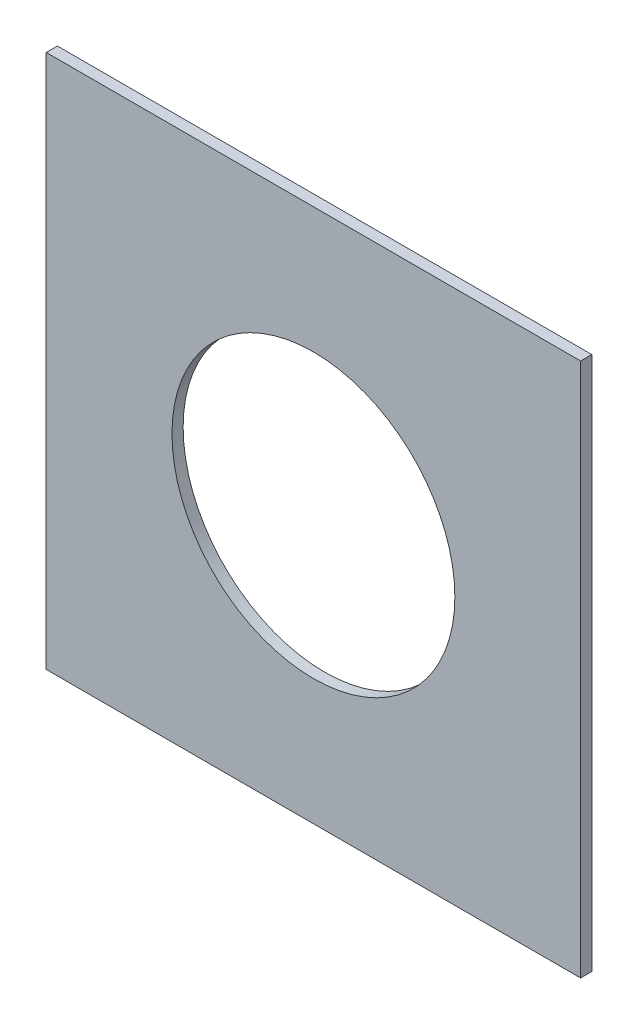
ISO-10303-21;
HEADER;
FILE_DESCRIPTION(('STEP AP214'),'2;1');
FILE_NAME('part.step','',(''),(''),'','','');
FILE_SCHEMA(('AUTOMOTIVE_DESIGN { 1 0 10303 214 1 1 1 1 }'));
ENDSEC;
DATA;
#1=APPLICATION_CONTEXT('core data for automotive mechanical design processes');
#2=APPLICATION_PROTOCOL_DEFINITION('international standard','automotive_design',2000,#1);
#3=PRODUCT_CONTEXT('',#1,'mechanical');
#4=PRODUCT('Part','Part','',(#3));
#5=PRODUCT_RELATED_PRODUCT_CATEGORY('part','',(#4));
#6=PRODUCT_DEFINITION_FORMATION('','',#4);
#7=PRODUCT_DEFINITION_CONTEXT('part definition',#1,'design');
#8=PRODUCT_DEFINITION('design','',#6,#7);
#9=PRODUCT_DEFINITION_SHAPE('','',#8);
#10=(LENGTH_UNIT() NAMED_UNIT(*) SI_UNIT(.MILLI.,.METRE.));
#11=(NAMED_UNIT(*) PLANE_ANGLE_UNIT() SI_UNIT($,.RADIAN.));
#12=(NAMED_UNIT(*) SI_UNIT($,.STERADIAN.) SOLID_ANGLE_UNIT());
#13=UNCERTAINTY_MEASURE_WITH_UNIT(LENGTH_MEASURE(1.E-05),#10,'distance_accuracy_value','');
#14=(GEOMETRIC_REPRESENTATION_CONTEXT(3) GLOBAL_UNCERTAINTY_ASSIGNED_CONTEXT((#13)) GLOBAL_UNIT_ASSIGNED_CONTEXT((#10,
#11,#12)) REPRESENTATION_CONTEXT('',''));
#15=CARTESIAN_POINT('',(0.,0.,0.));
#16=DIRECTION('',(0.,0.,1.));
#17=DIRECTION('',(1.,0.,0.));
#18=AXIS2_PLACEMENT_3D('',#15,#16,#17);
#19=CARTESIAN_POINT('',(46.8499984741211,63.4500007629394,0.));
#20=DIRECTION('',(0.,-1.,0.));
#21=DIRECTION('',(-1.,0.,0.));
#22=AXIS2_PLACEMENT_3D('',#19,#20,#21);
#23=PLANE('',#22);
#24=DIRECTION('',(-1.,0.,0.));
#25=VECTOR('',#24,1.);
#26=CARTESIAN_POINT('',(46.8499984741211,63.4500007629394,0.03556));
#27=LINE('',#26,#25);
#28=CARTESIAN_POINT('',(46.8499984741211,63.4500007629394,0.03556));
#29=VERTEX_POINT('',#28);
#30=CARTESIAN_POINT('',(45.1500015258789,63.4500007629394,0.03556));
#31=VERTEX_POINT('',#30);
#32=EDGE_CURVE('E11',#29,#31,#27,.T.);
#33=ORIENTED_EDGE('',*,*,#32,.F.);
#34=DIRECTION('',(0.,0.,1.));
#35=VECTOR('',#34,1.);
#36=CARTESIAN_POINT('',(46.8499984741211,63.4500007629394,0.));
#37=LINE('',#36,#35);
#38=CARTESIAN_POINT('',(46.8499984741211,63.4500007629394,0.));
#39=VERTEX_POINT('',#38);
#40=EDGE_CURVE('E24',#39,#29,#37,.T.);
#41=ORIENTED_EDGE('',*,*,#40,.F.);
#42=DIRECTION('',(-1.,0.,0.));
#43=VECTOR('',#42,1.);
#44=CARTESIAN_POINT('',(46.8499984741211,63.4500007629394,0.));
#45=LINE('',#44,#43);
#46=CARTESIAN_POINT('',(45.1500015258789,63.4500007629394,0.));
#47=VERTEX_POINT('',#46);
#48=EDGE_CURVE('E96',#39,#47,#45,.T.);
#49=ORIENTED_EDGE('',*,*,#48,.T.);
#50=DIRECTION('',(0.,0.,1.));
#51=VECTOR('',#50,1.);
#52=CARTESIAN_POINT('',(45.1500015258789,63.4500007629394,0.));
#53=LINE('',#52,#51);
#54=EDGE_CURVE('E37',#47,#31,#53,.T.);
#55=ORIENTED_EDGE('',*,*,#54,.T.);
#56=EDGE_LOOP('',(#33,#41,#49,#55));
#57=FACE_BOUND('',#56,.T.);
#58=ADVANCED_FACE('F17',(#57),#23,.F.);
#59=CARTESIAN_POINT('',(45.1500015258789,63.4500007629394,0.));
#60=DIRECTION('',(1.,0.,0.));
#61=DIRECTION('',(0.,-1.,0.));
#62=AXIS2_PLACEMENT_3D('',#59,#60,#61);
#63=PLANE('',#62);
#64=DIRECTION('',(0.,-1.,0.));
#65=VECTOR('',#64,1.);
#66=CARTESIAN_POINT('',(45.1500015258789,63.4500007629394,0.03556));
#67=LINE('',#66,#65);
#68=CARTESIAN_POINT('',(45.1500015258789,61.75,0.03556));
#69=VERTEX_POINT('',#68);
#70=EDGE_CURVE('E92',#31,#69,#67,.T.);
#71=ORIENTED_EDGE('',*,*,#70,.F.);
#72=ORIENTED_EDGE('',*,*,#54,.F.);
#73=DIRECTION('',(0.,-1.,0.));
#74=VECTOR('',#73,1.);
#75=CARTESIAN_POINT('',(45.1500015258789,63.4500007629394,0.));
#76=LINE('',#75,#74);
#77=CARTESIAN_POINT('',(45.1500015258789,61.75,0.));
#78=VERTEX_POINT('',#77);
#79=EDGE_CURVE('E89',#47,#78,#76,.T.);
#80=ORIENTED_EDGE('',*,*,#79,.T.);
#81=DIRECTION('',(0.,0.,1.));
#82=VECTOR('',#81,1.);
#83=CARTESIAN_POINT('',(45.1500015258789,61.75,0.));
#84=LINE('',#83,#82);
#85=EDGE_CURVE('E87',#78,#69,#84,.T.);
#86=ORIENTED_EDGE('',*,*,#85,.T.);
#87=EDGE_LOOP('',(#71,#72,#80,#86));
#88=FACE_BOUND('',#87,.T.);
#89=ADVANCED_FACE('F104',(#88),#63,.F.);
#90=CARTESIAN_POINT('',(45.1500015258789,61.75,0.));
#91=DIRECTION('',(0.,1.,0.));
#92=DIRECTION('',(1.,0.,0.));
#93=AXIS2_PLACEMENT_3D('',#90,#91,#92);
#94=PLANE('',#93);
#95=DIRECTION('',(1.,0.,0.));
#96=VECTOR('',#95,1.);
#97=CARTESIAN_POINT('',(45.1500015258789,61.75,0.03556));
#98=LINE('',#97,#96);
#99=CARTESIAN_POINT('',(46.8499984741211,61.75,0.03556));
#100=VERTEX_POINT('',#99);
#101=EDGE_CURVE('E84',#69,#100,#98,.T.);
#102=ORIENTED_EDGE('',*,*,#101,.F.);
#103=ORIENTED_EDGE('',*,*,#85,.F.);
#104=DIRECTION('',(1.,0.,0.));
#105=VECTOR('',#104,1.);
#106=CARTESIAN_POINT('',(45.1500015258789,61.75,0.));
#107=LINE('',#106,#105);
#108=CARTESIAN_POINT('',(46.8499984741211,61.75,0.));
#109=VERTEX_POINT('',#108);
#110=EDGE_CURVE('E81',#78,#109,#107,.T.);
#111=ORIENTED_EDGE('',*,*,#110,.T.);
#112=DIRECTION('',(0.,0.,1.));
#113=VECTOR('',#112,1.);
#114=CARTESIAN_POINT('',(46.8499984741211,61.75,0.));
#115=LINE('',#114,#113);
#116=EDGE_CURVE('E79',#109,#100,#115,.T.);
#117=ORIENTED_EDGE('',*,*,#116,.T.);
#118=EDGE_LOOP('',(#102,#103,#111,#117));
#119=FACE_BOUND('',#118,.T.);
#120=ADVANCED_FACE('F110',(#119),#94,.F.);
#121=CARTESIAN_POINT('',(46.8499984741211,61.75,0.));
#122=DIRECTION('',(-1.,0.,0.));
#123=DIRECTION('',(0.,1.,0.));
#124=AXIS2_PLACEMENT_3D('',#121,#122,#123);
#125=PLANE('',#124);
#126=DIRECTION('',(0.,1.,0.));
#127=VECTOR('',#126,1.);
#128=CARTESIAN_POINT('',(46.8499984741211,61.75,0.03556));
#129=LINE('',#128,#127);
#130=EDGE_CURVE('E76',#100,#29,#129,.T.);
#131=ORIENTED_EDGE('',*,*,#130,.F.);
#132=ORIENTED_EDGE('',*,*,#116,.F.);
#133=DIRECTION('',(0.,1.,0.));
#134=VECTOR('',#133,1.);
#135=CARTESIAN_POINT('',(46.8499984741211,61.75,0.));
#136=LINE('',#135,#134);
#137=EDGE_CURVE('E68',#109,#39,#136,.T.);
#138=ORIENTED_EDGE('',*,*,#137,.T.);
#139=ORIENTED_EDGE('',*,*,#40,.T.);
#140=EDGE_LOOP('',(#131,#132,#138,#139));
#141=FACE_BOUND('',#140,.T.);
#142=ADVANCED_FACE('F111',(#141),#125,.F.);
#143=CARTESIAN_POINT('',(46.0000096,62.5999764,0.));
#144=DIRECTION('',(0.,0.,-1.));
#145=DIRECTION('',(1.,0.,0.));
#146=AXIS2_PLACEMENT_3D('',#143,#144,#145);
#147=CYLINDRICAL_SURFACE('',#146,0.4499991);
#148=DIRECTION('',(0.,0.,1.));
#149=VECTOR('',#148,1.);
#150=CARTESIAN_POINT('',(46.4500087,62.5999764,0.));
#151=LINE('',#150,#149);
#152=CARTESIAN_POINT('',(46.4500087,62.5999764,0.));
#153=VERTEX_POINT('',#152);
#154=CARTESIAN_POINT('',(46.4500087,62.5999764,0.03556));
#155=VERTEX_POINT('',#154);
#156=EDGE_CURVE('E62',#153,#155,#151,.T.);
#157=ORIENTED_EDGE('',*,*,#156,.T.);
#158=CARTESIAN_POINT('',(46.0000096,62.5999764,0.03556));
#159=DIRECTION('',(0.,0.,1.));
#160=DIRECTION('',(1.,0.,0.));
#161=AXIS2_PLACEMENT_3D('',#158,#159,#160);
#162=CIRCLE('',#161,0.4499991);
#163=EDGE_CURVE('E67',#155,#155,#162,.T.);
#164=ORIENTED_EDGE('',*,*,#163,.T.);
#165=ORIENTED_EDGE('',*,*,#156,.F.);
#166=CARTESIAN_POINT('',(46.0000096,62.5999764,0.));
#167=DIRECTION('',(0.,0.,1.));
#168=DIRECTION('',(1.,0.,0.));
#169=AXIS2_PLACEMENT_3D('',#166,#167,#168);
#170=CIRCLE('',#169,0.4499991);
#171=EDGE_CURVE('E65',#153,#153,#170,.T.);
#172=ORIENTED_EDGE('',*,*,#171,.F.);
#173=EDGE_LOOP('',(#157,#164,#165,#172));
#174=FACE_BOUND('',#173,.T.);
#175=ADVANCED_FACE('F64',(#174),#147,.F.);
#176=CARTESIAN_POINT('',(46.8499984741211,63.4500007629394,0.));
#177=DIRECTION('',(0.,0.,-1.));
#178=DIRECTION('',(-1.,0.,0.));
#179=AXIS2_PLACEMENT_3D('',#176,#177,#178);
#180=PLANE('',#179);
#181=ORIENTED_EDGE('',*,*,#137,.F.);
#182=ORIENTED_EDGE('',*,*,#110,.F.);
#183=ORIENTED_EDGE('',*,*,#79,.F.);
#184=ORIENTED_EDGE('',*,*,#48,.F.);
#185=EDGE_LOOP('',(#181,#182,#183,#184));
#186=FACE_BOUND('',#185,.T.);
#187=ORIENTED_EDGE('',*,*,#171,.T.);
#188=EDGE_LOOP('',(#187));
#189=FACE_BOUND('',#188,.T.);
#190=ADVANCED_FACE('F71',(#186,#189),#180,.T.);
#191=CARTESIAN_POINT('',(46.8499984741211,63.4500007629394,0.03556));
#192=DIRECTION('',(0.,0.,-1.));
#193=DIRECTION('',(-1.,0.,0.));
#194=AXIS2_PLACEMENT_3D('',#191,#192,#193);
#195=PLANE('',#194);
#196=ORIENTED_EDGE('',*,*,#32,.T.);
#197=ORIENTED_EDGE('',*,*,#70,.T.);
#198=ORIENTED_EDGE('',*,*,#101,.T.);
#199=ORIENTED_EDGE('',*,*,#130,.T.);
#200=EDGE_LOOP('',(#196,#197,#198,#199));
#201=FACE_BOUND('',#200,.T.);
#202=ORIENTED_EDGE('',*,*,#163,.F.);
#203=EDGE_LOOP('',(#202));
#204=FACE_BOUND('',#203,.T.);
#205=ADVANCED_FACE('F107',(#201,#204),#195,.F.);
#206=CLOSED_SHELL('',(#58,#89,#120,#142,#175,#190,#205));
#207=MANIFOLD_SOLID_BREP('B1',#206);
#208=ADVANCED_BREP_SHAPE_REPRESENTATION('',(#18,#207),#14);
#209=SHAPE_DEFINITION_REPRESENTATION(#9,#208);
ENDSEC;
END-ISO-10303-21;
